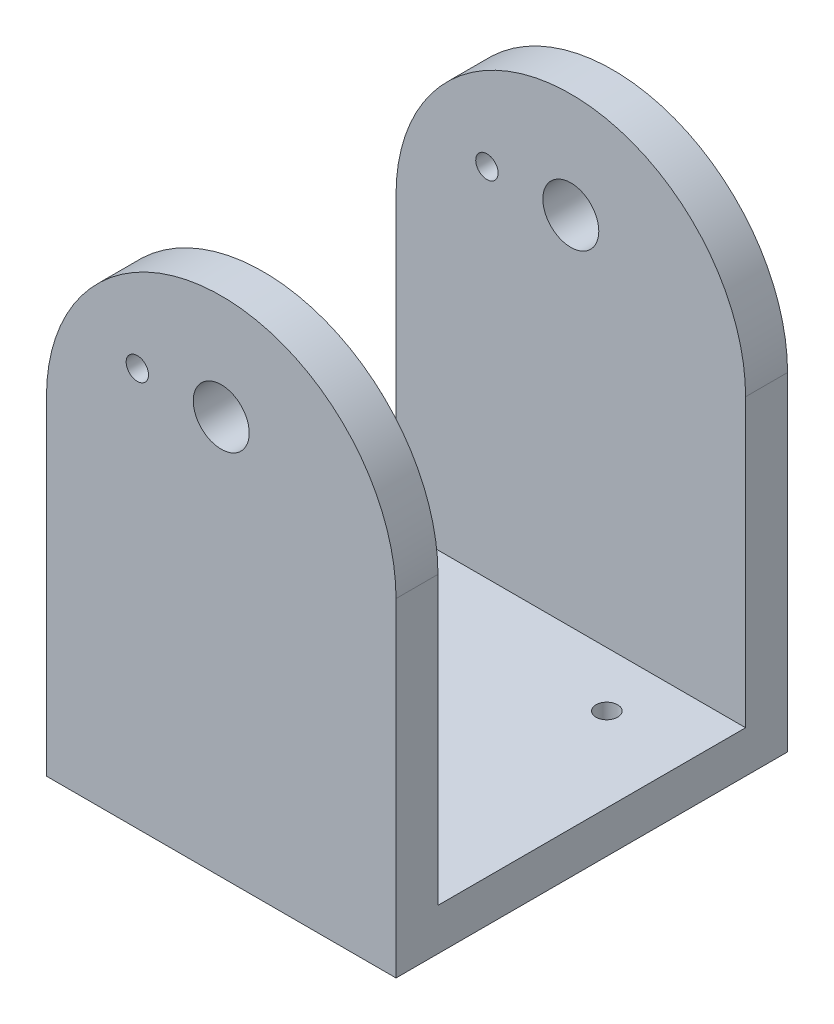
ISO-10303-21;
HEADER;
FILE_DESCRIPTION(('STEP AP214'),'2;1');
FILE_NAME('part.step','',(''),(''),'','','');
FILE_SCHEMA(('AUTOMOTIVE_DESIGN { 1 0 10303 214 1 1 1 1 }'));
ENDSEC;
DATA;
#1=APPLICATION_CONTEXT('core data for automotive mechanical design processes');
#2=APPLICATION_PROTOCOL_DEFINITION('international standard','automotive_design',2000,#1);
#3=PRODUCT_CONTEXT('',#1,'mechanical');
#4=PRODUCT('Part','Part','',(#3));
#5=PRODUCT_RELATED_PRODUCT_CATEGORY('part','',(#4));
#6=PRODUCT_DEFINITION_FORMATION('','',#4);
#7=PRODUCT_DEFINITION_CONTEXT('part definition',#1,'design');
#8=PRODUCT_DEFINITION('design','',#6,#7);
#9=PRODUCT_DEFINITION_SHAPE('','',#8);
#10=(LENGTH_UNIT() NAMED_UNIT(*) SI_UNIT(.MILLI.,.METRE.));
#11=(NAMED_UNIT(*) PLANE_ANGLE_UNIT() SI_UNIT($,.RADIAN.));
#12=(NAMED_UNIT(*) SI_UNIT($,.STERADIAN.) SOLID_ANGLE_UNIT());
#13=UNCERTAINTY_MEASURE_WITH_UNIT(LENGTH_MEASURE(1.E-05),#10,'distance_accuracy_value','');
#14=(GEOMETRIC_REPRESENTATION_CONTEXT(3) GLOBAL_UNCERTAINTY_ASSIGNED_CONTEXT((#13)) GLOBAL_UNIT_ASSIGNED_CONTEXT((#10,
#11,#12)) REPRESENTATION_CONTEXT('',''));
#15=CARTESIAN_POINT('',(0.,0.,0.));
#16=DIRECTION('',(0.,0.,1.));
#17=DIRECTION('',(1.,0.,0.));
#18=AXIS2_PLACEMENT_3D('',#15,#16,#17);
#19=CARTESIAN_POINT('',(0.,47.,-28.));
#20=DIRECTION('',(0.,0.,1.));
#21=DIRECTION('',(1.,0.,0.));
#22=AXIS2_PLACEMENT_3D('',#19,#20,#21);
#23=CYLINDRICAL_SURFACE('',#22,25.);
#24=CARTESIAN_POINT('',(0.,47.,-22.));
#25=DIRECTION('',(0.,0.,-1.));
#26=DIRECTION('',(0.,1.,0.));
#27=AXIS2_PLACEMENT_3D('',#24,#25,#26);
#28=CIRCLE('',#27,25.);
#29=CARTESIAN_POINT('',(25.,47.,-22.));
#30=VERTEX_POINT('',#29);
#31=CARTESIAN_POINT('',(-25.,47.,-22.));
#32=VERTEX_POINT('',#31);
#33=EDGE_CURVE('E11',#30,#32,#28,.F.);
#34=ORIENTED_EDGE('',*,*,#33,.F.);
#35=DIRECTION('',(0.,0.,-1.));
#36=VECTOR('',#35,1.);
#37=CARTESIAN_POINT('',(25.,47.,28.));
#38=LINE('',#37,#36);
#39=CARTESIAN_POINT('',(25.,47.,-28.));
#40=VERTEX_POINT('',#39);
#41=EDGE_CURVE('E90',#30,#40,#38,.T.);
#42=ORIENTED_EDGE('',*,*,#41,.T.);
#43=CARTESIAN_POINT('',(0.,47.,-28.));
#44=DIRECTION('',(0.,0.,1.));
#45=DIRECTION('',(1.,0.,0.));
#46=AXIS2_PLACEMENT_3D('',#43,#44,#45);
#47=CIRCLE('',#46,25.);
#48=CARTESIAN_POINT('',(-25.,47.,-28.));
#49=VERTEX_POINT('',#48);
#50=EDGE_CURVE('E146',#40,#49,#47,.T.);
#51=ORIENTED_EDGE('',*,*,#50,.T.);
#52=DIRECTION('',(0.,0.,1.));
#53=VECTOR('',#52,1.);
#54=CARTESIAN_POINT('',(-25.,47.,28.));
#55=LINE('',#54,#53);
#56=EDGE_CURVE('E154',#49,#32,#55,.T.);
#57=ORIENTED_EDGE('',*,*,#56,.T.);
#58=EDGE_LOOP('',(#34,#42,#51,#57));
#59=FACE_BOUND('',#58,.T.);
#60=ADVANCED_FACE('F36',(#59),#23,.T.);
#61=CARTESIAN_POINT('',(25.,47.,28.));
#62=DIRECTION('',(-1.,0.,0.));
#63=DIRECTION('',(0.,0.,1.));
#64=AXIS2_PLACEMENT_3D('',#61,#62,#63);
#65=PLANE('',#64);
#66=ORIENTED_EDGE('',*,*,#41,.F.);
#67=DIRECTION('',(0.,-1.,0.));
#68=VECTOR('',#67,1.);
#69=CARTESIAN_POINT('',(25.,75.477636763267,-22.));
#70=LINE('',#69,#68);
#71=CARTESIAN_POINT('',(25.,6.,-22.));
#72=VERTEX_POINT('',#71);
#73=EDGE_CURVE('E118',#30,#72,#70,.T.);
#74=ORIENTED_EDGE('',*,*,#73,.T.);
#75=DIRECTION('',(0.,0.,1.));
#76=VECTOR('',#75,1.);
#77=CARTESIAN_POINT('',(25.,6.,-22.));
#78=LINE('',#77,#76);
#79=CARTESIAN_POINT('',(25.,6.,22.));
#80=VERTEX_POINT('',#79);
#81=EDGE_CURVE('E128',#72,#80,#78,.T.);
#82=ORIENTED_EDGE('',*,*,#81,.T.);
#83=DIRECTION('',(0.,1.,0.));
#84=VECTOR('',#83,1.);
#85=CARTESIAN_POINT('',(25.,6.,22.));
#86=LINE('',#85,#84);
#87=CARTESIAN_POINT('',(25.,47.,22.));
#88=VERTEX_POINT('',#87);
#89=EDGE_CURVE('E125',#80,#88,#86,.T.);
#90=ORIENTED_EDGE('',*,*,#89,.T.);
#91=CARTESIAN_POINT('',(25.,47.,28.));
#92=VERTEX_POINT('',#91);
#93=EDGE_CURVE('E151',#92,#88,#38,.T.);
#94=ORIENTED_EDGE('',*,*,#93,.F.);
#95=DIRECTION('',(0.,-1.,0.));
#96=VECTOR('',#95,1.);
#97=CARTESIAN_POINT('',(25.,47.,28.));
#98=LINE('',#97,#96);
#99=CARTESIAN_POINT('',(25.,0.,28.));
#100=VERTEX_POINT('',#99);
#101=EDGE_CURVE('E157',#92,#100,#98,.T.);
#102=ORIENTED_EDGE('',*,*,#101,.T.);
#103=DIRECTION('',(0.,0.,-1.));
#104=VECTOR('',#103,1.);
#105=CARTESIAN_POINT('',(25.,0.,28.));
#106=LINE('',#105,#104);
#107=CARTESIAN_POINT('',(25.,0.,-28.));
#108=VERTEX_POINT('',#107);
#109=EDGE_CURVE('E148',#100,#108,#106,.T.);
#110=ORIENTED_EDGE('',*,*,#109,.T.);
#111=DIRECTION('',(0.,-1.,0.));
#112=VECTOR('',#111,1.);
#113=CARTESIAN_POINT('',(25.,47.,-28.));
#114=LINE('',#113,#112);
#115=EDGE_CURVE('E171',#40,#108,#114,.T.);
#116=ORIENTED_EDGE('',*,*,#115,.F.);
#117=EDGE_LOOP('',(#66,#74,#82,#90,#94,#102,#110,#116));
#118=FACE_BOUND('',#117,.T.);
#119=ADVANCED_FACE('F38',(#118),#65,.F.);
#120=CARTESIAN_POINT('',(-25.,47.,-28.));
#121=DIRECTION('',(0.,0.,1.));
#122=DIRECTION('',(1.,0.,0.));
#123=AXIS2_PLACEMENT_3D('',#120,#121,#122);
#124=PLANE('',#123);
#125=CARTESIAN_POINT('',(0.,57.,-28.));
#126=DIRECTION('',(0.,0.,1.));
#127=DIRECTION('',(1.,0.,0.));
#128=AXIS2_PLACEMENT_3D('',#125,#126,#127);
#129=CIRCLE('',#128,4.);
#130=CARTESIAN_POINT('',(4.,57.,-28.));
#131=VERTEX_POINT('',#130);
#132=EDGE_CURVE('E177',#131,#131,#129,.T.);
#133=ORIENTED_EDGE('',*,*,#132,.T.);
#134=EDGE_LOOP('',(#133));
#135=FACE_BOUND('',#134,.T.);
#136=CARTESIAN_POINT('',(-12.,57.,-28.));
#137=DIRECTION('',(0.,0.,1.));
#138=DIRECTION('',(1.,0.,0.));
#139=AXIS2_PLACEMENT_3D('',#136,#137,#138);
#140=CIRCLE('',#139,1.6);
#141=CARTESIAN_POINT('',(-10.4,57.,-28.));
#142=VERTEX_POINT('',#141);
#143=EDGE_CURVE('E187',#142,#142,#140,.T.);
#144=ORIENTED_EDGE('',*,*,#143,.T.);
#145=EDGE_LOOP('',(#144));
#146=FACE_BOUND('',#145,.T.);
#147=DIRECTION('',(-1.,0.,0.));
#148=VECTOR('',#147,1.);
#149=CARTESIAN_POINT('',(-25.,0.,-28.));
#150=LINE('',#149,#148);
#151=CARTESIAN_POINT('',(-25.,0.,-28.));
#152=VERTEX_POINT('',#151);
#153=EDGE_CURVE('E160',#108,#152,#150,.T.);
#154=ORIENTED_EDGE('',*,*,#153,.T.);
#155=DIRECTION('',(0.,-1.,0.));
#156=VECTOR('',#155,1.);
#157=CARTESIAN_POINT('',(-25.,47.,-28.));
#158=LINE('',#157,#156);
#159=EDGE_CURVE('E168',#49,#152,#158,.T.);
#160=ORIENTED_EDGE('',*,*,#159,.F.);
#161=ORIENTED_EDGE('',*,*,#50,.F.);
#162=ORIENTED_EDGE('',*,*,#115,.T.);
#163=EDGE_LOOP('',(#154,#160,#161,#162));
#164=FACE_BOUND('',#163,.T.);
#165=ADVANCED_FACE('F245',(#135,#146,#164),#124,.F.);
#166=CARTESIAN_POINT('',(-25.,47.,28.));
#167=DIRECTION('',(1.,0.,0.));
#168=DIRECTION('',(0.,0.,-1.));
#169=AXIS2_PLACEMENT_3D('',#166,#167,#168);
#170=PLANE('',#169);
#171=DIRECTION('',(0.,0.,1.));
#172=VECTOR('',#171,1.);
#173=CARTESIAN_POINT('',(-25.,6.,-22.));
#174=LINE('',#173,#172);
#175=CARTESIAN_POINT('',(-25.,6.,-22.));
#176=VERTEX_POINT('',#175);
#177=CARTESIAN_POINT('',(-25.,6.,22.));
#178=VERTEX_POINT('',#177);
#179=EDGE_CURVE('E135',#176,#178,#174,.T.);
#180=ORIENTED_EDGE('',*,*,#179,.F.);
#181=DIRECTION('',(0.,-1.,0.));
#182=VECTOR('',#181,1.);
#183=CARTESIAN_POINT('',(-25.,75.477636763267,-22.));
#184=LINE('',#183,#182);
#185=EDGE_CURVE('E120',#32,#176,#184,.T.);
#186=ORIENTED_EDGE('',*,*,#185,.F.);
#187=ORIENTED_EDGE('',*,*,#56,.F.);
#188=ORIENTED_EDGE('',*,*,#159,.T.);
#189=DIRECTION('',(0.,0.,1.));
#190=VECTOR('',#189,1.);
#191=CARTESIAN_POINT('',(-25.,0.,28.));
#192=LINE('',#191,#190);
#193=CARTESIAN_POINT('',(-25.,0.,28.));
#194=VERTEX_POINT('',#193);
#195=EDGE_CURVE('E162',#152,#194,#192,.T.);
#196=ORIENTED_EDGE('',*,*,#195,.T.);
#197=DIRECTION('',(0.,-1.,0.));
#198=VECTOR('',#197,1.);
#199=CARTESIAN_POINT('',(-25.,47.,28.));
#200=LINE('',#199,#198);
#201=CARTESIAN_POINT('',(-25.,47.,28.));
#202=VERTEX_POINT('',#201);
#203=EDGE_CURVE('E166',#202,#194,#200,.T.);
#204=ORIENTED_EDGE('',*,*,#203,.F.);
#205=CARTESIAN_POINT('',(-25.,47.,22.));
#206=VERTEX_POINT('',#205);
#207=EDGE_CURVE('E61',#206,#202,#55,.T.);
#208=ORIENTED_EDGE('',*,*,#207,.F.);
#209=DIRECTION('',(0.,1.,0.));
#210=VECTOR('',#209,1.);
#211=CARTESIAN_POINT('',(-25.,6.,22.));
#212=LINE('',#211,#210);
#213=EDGE_CURVE('E53',#178,#206,#212,.T.);
#214=ORIENTED_EDGE('',*,*,#213,.F.);
#215=EDGE_LOOP('',(#180,#186,#187,#188,#196,#204,#208,#214));
#216=FACE_BOUND('',#215,.T.);
#217=ADVANCED_FACE('F256',(#216),#170,.F.);
#218=CARTESIAN_POINT('',(-25.,47.,28.));
#219=DIRECTION('',(0.,0.,-1.));
#220=DIRECTION('',(-1.,0.,0.));
#221=AXIS2_PLACEMENT_3D('',#218,#219,#220);
#222=PLANE('',#221);
#223=CARTESIAN_POINT('',(0.,57.,28.));
#224=DIRECTION('',(0.,0.,1.));
#225=DIRECTION('',(1.,0.,0.));
#226=AXIS2_PLACEMENT_3D('',#223,#224,#225);
#227=CIRCLE('',#226,4.);
#228=CARTESIAN_POINT('',(4.,57.,28.));
#229=VERTEX_POINT('',#228);
#230=EDGE_CURVE('E182',#229,#229,#227,.T.);
#231=ORIENTED_EDGE('',*,*,#230,.F.);
#232=EDGE_LOOP('',(#231));
#233=FACE_BOUND('',#232,.T.);
#234=CARTESIAN_POINT('',(-12.,57.,28.));
#235=DIRECTION('',(0.,0.,1.));
#236=DIRECTION('',(1.,0.,0.));
#237=AXIS2_PLACEMENT_3D('',#234,#235,#236);
#238=CIRCLE('',#237,1.6);
#239=CARTESIAN_POINT('',(-10.4,57.,28.));
#240=VERTEX_POINT('',#239);
#241=EDGE_CURVE('E195',#240,#240,#238,.T.);
#242=ORIENTED_EDGE('',*,*,#241,.F.);
#243=EDGE_LOOP('',(#242));
#244=FACE_BOUND('',#243,.T.);
#245=DIRECTION('',(1.,0.,0.));
#246=VECTOR('',#245,1.);
#247=CARTESIAN_POINT('',(-25.,0.,28.));
#248=LINE('',#247,#246);
#249=EDGE_CURVE('E83',#194,#100,#248,.T.);
#250=ORIENTED_EDGE('',*,*,#249,.T.);
#251=ORIENTED_EDGE('',*,*,#101,.F.);
#252=CARTESIAN_POINT('',(0.,47.,28.));
#253=DIRECTION('',(0.,0.,1.));
#254=DIRECTION('',(1.,0.,0.));
#255=AXIS2_PLACEMENT_3D('',#252,#253,#254);
#256=CIRCLE('',#255,25.);
#257=EDGE_CURVE('E144',#92,#202,#256,.T.);
#258=ORIENTED_EDGE('',*,*,#257,.T.);
#259=ORIENTED_EDGE('',*,*,#203,.T.);
#260=EDGE_LOOP('',(#250,#251,#258,#259));
#261=FACE_BOUND('',#260,.T.);
#262=ADVANCED_FACE('F254',(#233,#244,#261),#222,.F.);
#263=CARTESIAN_POINT('',(0.,0.,0.));
#264=DIRECTION('',(0.,-1.,0.));
#265=DIRECTION('',(0.,0.,-1.));
#266=AXIS2_PLACEMENT_3D('',#263,#264,#265);
#267=PLANE('',#266);
#268=CARTESIAN_POINT('',(13.,0.,14.15));
#269=DIRECTION('',(0.,1.,0.));
#270=DIRECTION('',(0.,0.,1.));
#271=AXIS2_PLACEMENT_3D('',#268,#269,#270);
#272=CIRCLE('',#271,1.55);
#273=CARTESIAN_POINT('',(13.,0.,15.7));
#274=VERTEX_POINT('',#273);
#275=EDGE_CURVE('E197',#274,#274,#272,.T.);
#276=ORIENTED_EDGE('',*,*,#275,.T.);
#277=EDGE_LOOP('',(#276));
#278=FACE_BOUND('',#277,.T.);
#279=CARTESIAN_POINT('',(-12.,0.,0.));
#280=DIRECTION('',(0.,1.,0.));
#281=DIRECTION('',(0.,0.,1.));
#282=AXIS2_PLACEMENT_3D('',#279,#280,#281);
#283=CIRCLE('',#282,1.55);
#284=CARTESIAN_POINT('',(-12.,0.,1.55));
#285=VERTEX_POINT('',#284);
#286=EDGE_CURVE('E206',#285,#285,#283,.T.);
#287=ORIENTED_EDGE('',*,*,#286,.T.);
#288=EDGE_LOOP('',(#287));
#289=FACE_BOUND('',#288,.T.);
#290=CARTESIAN_POINT('',(13.,0.,-14.15));
#291=DIRECTION('',(0.,1.,0.));
#292=DIRECTION('',(0.,0.,1.));
#293=AXIS2_PLACEMENT_3D('',#290,#291,#292);
#294=CIRCLE('',#293,1.55);
#295=CARTESIAN_POINT('',(13.,0.,-12.6));
#296=VERTEX_POINT('',#295);
#297=EDGE_CURVE('E213',#296,#296,#294,.T.);
#298=ORIENTED_EDGE('',*,*,#297,.T.);
#299=EDGE_LOOP('',(#298));
#300=FACE_BOUND('',#299,.T.);
#301=ORIENTED_EDGE('',*,*,#109,.F.);
#302=ORIENTED_EDGE('',*,*,#249,.F.);
#303=ORIENTED_EDGE('',*,*,#195,.F.);
#304=ORIENTED_EDGE('',*,*,#153,.F.);
#305=EDGE_LOOP('',(#301,#302,#303,#304));
#306=FACE_BOUND('',#305,.T.);
#307=ADVANCED_FACE('F248',(#278,#289,#300,#306),#267,.T.);
#308=CARTESIAN_POINT('',(0.,47.,22.));
#309=DIRECTION('',(0.,0.,1.));
#310=DIRECTION('',(1.,0.,0.));
#311=AXIS2_PLACEMENT_3D('',#308,#309,#310);
#312=CIRCLE('',#311,25.);
#313=EDGE_CURVE('E45',#206,#88,#312,.F.);
#314=ORIENTED_EDGE('',*,*,#313,.F.);
#315=ORIENTED_EDGE('',*,*,#207,.T.);
#316=ORIENTED_EDGE('',*,*,#257,.F.);
#317=ORIENTED_EDGE('',*,*,#93,.T.);
#318=EDGE_LOOP('',(#314,#315,#316,#317));
#319=FACE_BOUND('',#318,.T.);
#320=ADVANCED_FACE('F241',(#319),#23,.T.);
#321=CARTESIAN_POINT('',(25.,75.477636763267,-22.));
#322=DIRECTION('',(0.,0.,-1.));
#323=DIRECTION('',(0.,1.,0.));
#324=AXIS2_PLACEMENT_3D('',#321,#322,#323);
#325=PLANE('',#324);
#326=CARTESIAN_POINT('',(0.,57.,-22.));
#327=DIRECTION('',(0.,0.,-1.));
#328=DIRECTION('',(0.,1.,0.));
#329=AXIS2_PLACEMENT_3D('',#326,#327,#328);
#330=CIRCLE('',#329,4.);
#331=CARTESIAN_POINT('',(0.,61.,-22.));
#332=VERTEX_POINT('',#331);
#333=EDGE_CURVE('E138',#332,#332,#330,.T.);
#334=ORIENTED_EDGE('',*,*,#333,.T.);
#335=EDGE_LOOP('',(#334));
#336=FACE_BOUND('',#335,.T.);
#337=CARTESIAN_POINT('',(-12.,57.,-22.));
#338=DIRECTION('',(0.,0.,-1.));
#339=DIRECTION('',(0.,1.,0.));
#340=AXIS2_PLACEMENT_3D('',#337,#338,#339);
#341=CIRCLE('',#340,1.6);
#342=CARTESIAN_POINT('',(-12.,58.6,-22.));
#343=VERTEX_POINT('',#342);
#344=EDGE_CURVE('E176',#343,#343,#341,.T.);
#345=ORIENTED_EDGE('',*,*,#344,.T.);
#346=EDGE_LOOP('',(#345));
#347=FACE_BOUND('',#346,.T.);
#348=ORIENTED_EDGE('',*,*,#33,.T.);
#349=ORIENTED_EDGE('',*,*,#185,.T.);
#350=DIRECTION('',(-1.,0.,0.));
#351=VECTOR('',#350,1.);
#352=CARTESIAN_POINT('',(25.,6.,-22.));
#353=LINE('',#352,#351);
#354=EDGE_CURVE('E114',#72,#176,#353,.T.);
#355=ORIENTED_EDGE('',*,*,#354,.F.);
#356=ORIENTED_EDGE('',*,*,#73,.F.);
#357=EDGE_LOOP('',(#348,#349,#355,#356));
#358=FACE_BOUND('',#357,.T.);
#359=ADVANCED_FACE('F116',(#336,#347,#358),#325,.F.);
#360=CARTESIAN_POINT('',(25.,6.,22.));
#361=DIRECTION('',(0.,0.,1.));
#362=DIRECTION('',(1.,0.,0.));
#363=AXIS2_PLACEMENT_3D('',#360,#361,#362);
#364=PLANE('',#363);
#365=CARTESIAN_POINT('',(0.,57.,22.));
#366=DIRECTION('',(0.,0.,1.));
#367=DIRECTION('',(1.,0.,0.));
#368=AXIS2_PLACEMENT_3D('',#365,#366,#367);
#369=CIRCLE('',#368,4.);
#370=CARTESIAN_POINT('',(4.,57.,22.));
#371=VERTEX_POINT('',#370);
#372=EDGE_CURVE('E40',#371,#371,#369,.T.);
#373=ORIENTED_EDGE('',*,*,#372,.T.);
#374=EDGE_LOOP('',(#373));
#375=FACE_BOUND('',#374,.T.);
#376=CARTESIAN_POINT('',(-12.,57.,22.));
#377=DIRECTION('',(0.,0.,1.));
#378=DIRECTION('',(1.,0.,0.));
#379=AXIS2_PLACEMENT_3D('',#376,#377,#378);
#380=CIRCLE('',#379,1.6);
#381=CARTESIAN_POINT('',(-10.4,57.,22.));
#382=VERTEX_POINT('',#381);
#383=EDGE_CURVE('E174',#382,#382,#380,.T.);
#384=ORIENTED_EDGE('',*,*,#383,.T.);
#385=EDGE_LOOP('',(#384));
#386=FACE_BOUND('',#385,.T.);
#387=ORIENTED_EDGE('',*,*,#313,.T.);
#388=ORIENTED_EDGE('',*,*,#89,.F.);
#389=DIRECTION('',(-1.,0.,0.));
#390=VECTOR('',#389,1.);
#391=CARTESIAN_POINT('',(25.,6.,22.));
#392=LINE('',#391,#390);
#393=EDGE_CURVE('E124',#80,#178,#392,.T.);
#394=ORIENTED_EDGE('',*,*,#393,.T.);
#395=ORIENTED_EDGE('',*,*,#213,.T.);
#396=EDGE_LOOP('',(#387,#388,#394,#395));
#397=FACE_BOUND('',#396,.T.);
#398=ADVANCED_FACE('F224',(#375,#386,#397),#364,.F.);
#399=CARTESIAN_POINT('',(25.,6.,-22.));
#400=DIRECTION('',(0.,-1.,0.));
#401=DIRECTION('',(0.,0.,-1.));
#402=AXIS2_PLACEMENT_3D('',#399,#400,#401);
#403=PLANE('',#402);
#404=CARTESIAN_POINT('',(13.,6.,14.15));
#405=DIRECTION('',(0.,1.,0.));
#406=DIRECTION('',(0.,0.,1.));
#407=AXIS2_PLACEMENT_3D('',#404,#405,#406);
#408=CIRCLE('',#407,1.55);
#409=CARTESIAN_POINT('',(13.,6.,15.7));
#410=VERTEX_POINT('',#409);
#411=EDGE_CURVE('E201',#410,#410,#408,.T.);
#412=ORIENTED_EDGE('',*,*,#411,.F.);
#413=EDGE_LOOP('',(#412));
#414=FACE_BOUND('',#413,.T.);
#415=CARTESIAN_POINT('',(-12.,6.,0.));
#416=DIRECTION('',(0.,1.,0.));
#417=DIRECTION('',(0.,0.,1.));
#418=AXIS2_PLACEMENT_3D('',#415,#416,#417);
#419=CIRCLE('',#418,1.55);
#420=CARTESIAN_POINT('',(-12.,6.,1.55));
#421=VERTEX_POINT('',#420);
#422=EDGE_CURVE('E211',#421,#421,#419,.T.);
#423=ORIENTED_EDGE('',*,*,#422,.F.);
#424=EDGE_LOOP('',(#423));
#425=FACE_BOUND('',#424,.T.);
#426=CARTESIAN_POINT('',(13.,6.,-14.15));
#427=DIRECTION('',(0.,1.,0.));
#428=DIRECTION('',(0.,0.,1.));
#429=AXIS2_PLACEMENT_3D('',#426,#427,#428);
#430=CIRCLE('',#429,1.55);
#431=CARTESIAN_POINT('',(13.,6.,-12.6));
#432=VERTEX_POINT('',#431);
#433=EDGE_CURVE('E190',#432,#432,#430,.T.);
#434=ORIENTED_EDGE('',*,*,#433,.F.);
#435=EDGE_LOOP('',(#434));
#436=FACE_BOUND('',#435,.T.);
#437=ORIENTED_EDGE('',*,*,#179,.T.);
#438=ORIENTED_EDGE('',*,*,#393,.F.);
#439=ORIENTED_EDGE('',*,*,#81,.F.);
#440=ORIENTED_EDGE('',*,*,#354,.T.);
#441=EDGE_LOOP('',(#437,#438,#439,#440));
#442=FACE_BOUND('',#441,.T.);
#443=ADVANCED_FACE('F129',(#414,#425,#436,#442),#403,.F.);
#444=CARTESIAN_POINT('',(-12.,57.,-28.));
#445=DIRECTION('',(0.,0.,1.));
#446=DIRECTION('',(1.,0.,0.));
#447=AXIS2_PLACEMENT_3D('',#444,#445,#446);
#448=CYLINDRICAL_SURFACE('',#447,1.6);
#449=ORIENTED_EDGE('',*,*,#241,.T.);
#450=EDGE_LOOP('',(#449));
#451=FACE_BOUND('',#450,.T.);
#452=ORIENTED_EDGE('',*,*,#383,.F.);
#453=EDGE_LOOP('',(#452));
#454=FACE_BOUND('',#453,.T.);
#455=ADVANCED_FACE('F223',(#451,#454),#448,.F.);
#456=CARTESIAN_POINT('',(0.,57.,-28.));
#457=DIRECTION('',(0.,0.,1.));
#458=DIRECTION('',(1.,0.,0.));
#459=AXIS2_PLACEMENT_3D('',#456,#457,#458);
#460=CYLINDRICAL_SURFACE('',#459,4.);
#461=ORIENTED_EDGE('',*,*,#230,.T.);
#462=EDGE_LOOP('',(#461));
#463=FACE_BOUND('',#462,.T.);
#464=ORIENTED_EDGE('',*,*,#372,.F.);
#465=EDGE_LOOP('',(#464));
#466=FACE_BOUND('',#465,.T.);
#467=ADVANCED_FACE('F231',(#463,#466),#460,.F.);
#468=ORIENTED_EDGE('',*,*,#143,.F.);
#469=EDGE_LOOP('',(#468));
#470=FACE_BOUND('',#469,.T.);
#471=ORIENTED_EDGE('',*,*,#344,.F.);
#472=EDGE_LOOP('',(#471));
#473=FACE_BOUND('',#472,.T.);
#474=ADVANCED_FACE('F233',(#470,#473),#448,.F.);
#475=ORIENTED_EDGE('',*,*,#132,.F.);
#476=EDGE_LOOP('',(#475));
#477=FACE_BOUND('',#476,.T.);
#478=ORIENTED_EDGE('',*,*,#333,.F.);
#479=EDGE_LOOP('',(#478));
#480=FACE_BOUND('',#479,.T.);
#481=ADVANCED_FACE('F280',(#477,#480),#460,.F.);
#482=CARTESIAN_POINT('',(13.,0.,-14.15));
#483=DIRECTION('',(0.,1.,0.));
#484=DIRECTION('',(0.,0.,1.));
#485=AXIS2_PLACEMENT_3D('',#482,#483,#484);
#486=CYLINDRICAL_SURFACE('',#485,1.55);
#487=ORIENTED_EDGE('',*,*,#297,.F.);
#488=EDGE_LOOP('',(#487));
#489=FACE_BOUND('',#488,.T.);
#490=ORIENTED_EDGE('',*,*,#433,.T.);
#491=EDGE_LOOP('',(#490));
#492=FACE_BOUND('',#491,.T.);
#493=ADVANCED_FACE('F220',(#489,#492),#486,.F.);
#494=CARTESIAN_POINT('',(-12.,0.,0.));
#495=DIRECTION('',(0.,1.,0.));
#496=DIRECTION('',(0.,0.,1.));
#497=AXIS2_PLACEMENT_3D('',#494,#495,#496);
#498=CYLINDRICAL_SURFACE('',#497,1.55);
#499=ORIENTED_EDGE('',*,*,#286,.F.);
#500=EDGE_LOOP('',(#499));
#501=FACE_BOUND('',#500,.T.);
#502=ORIENTED_EDGE('',*,*,#422,.T.);
#503=EDGE_LOOP('',(#502));
#504=FACE_BOUND('',#503,.T.);
#505=ADVANCED_FACE('F293',(#501,#504),#498,.F.);
#506=CARTESIAN_POINT('',(13.,0.,14.15));
#507=DIRECTION('',(0.,1.,0.));
#508=DIRECTION('',(0.,0.,1.));
#509=AXIS2_PLACEMENT_3D('',#506,#507,#508);
#510=CYLINDRICAL_SURFACE('',#509,1.55);
#511=ORIENTED_EDGE('',*,*,#275,.F.);
#512=EDGE_LOOP('',(#511));
#513=FACE_BOUND('',#512,.T.);
#514=ORIENTED_EDGE('',*,*,#411,.T.);
#515=EDGE_LOOP('',(#514));
#516=FACE_BOUND('',#515,.T.);
#517=ADVANCED_FACE('F300',(#513,#516),#510,.F.);
#518=CLOSED_SHELL('',(#60,#119,#165,#217,#262,#307,#320,#359,#398,#443,#455,#467,#474,#481,#493,
#505,#517));
#519=MANIFOLD_SOLID_BREP('B2',#518);
#520=ADVANCED_BREP_SHAPE_REPRESENTATION('',(#18,#519),#14);
#521=SHAPE_DEFINITION_REPRESENTATION(#9,#520);
ENDSEC;
END-ISO-10303-21;
